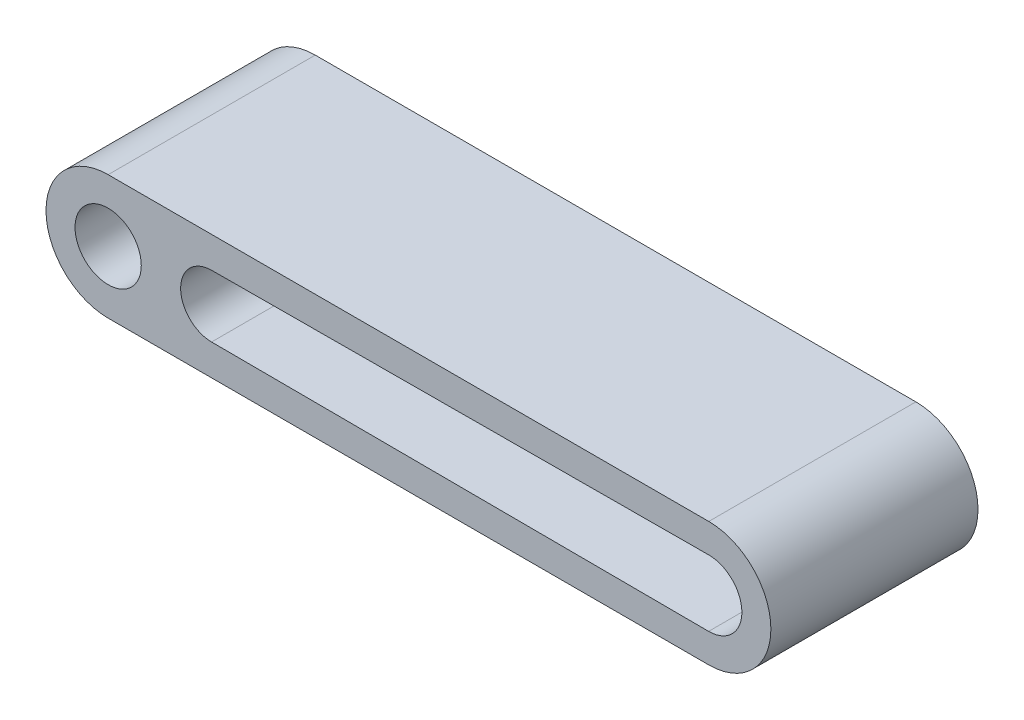
ISO-10303-21;
HEADER;
FILE_DESCRIPTION(('STEP AP214'),'2;1');
FILE_NAME('part.step','',(''),(''),'','','');
FILE_SCHEMA(('AUTOMOTIVE_DESIGN { 1 0 10303 214 1 1 1 1 }'));
ENDSEC;
DATA;
#1=APPLICATION_CONTEXT('core data for automotive mechanical design processes');
#2=APPLICATION_PROTOCOL_DEFINITION('international standard','automotive_design',2000,#1);
#3=PRODUCT_CONTEXT('',#1,'mechanical');
#4=PRODUCT('Part','Part','',(#3));
#5=PRODUCT_RELATED_PRODUCT_CATEGORY('part','',(#4));
#6=PRODUCT_DEFINITION_FORMATION('','',#4);
#7=PRODUCT_DEFINITION_CONTEXT('part definition',#1,'design');
#8=PRODUCT_DEFINITION('design','',#6,#7);
#9=PRODUCT_DEFINITION_SHAPE('','',#8);
#10=(LENGTH_UNIT() NAMED_UNIT(*) SI_UNIT(.MILLI.,.METRE.));
#11=(NAMED_UNIT(*) PLANE_ANGLE_UNIT() SI_UNIT($,.RADIAN.));
#12=(NAMED_UNIT(*) SI_UNIT($,.STERADIAN.) SOLID_ANGLE_UNIT());
#13=UNCERTAINTY_MEASURE_WITH_UNIT(LENGTH_MEASURE(1.E-05),#10,'distance_accuracy_value','');
#14=(GEOMETRIC_REPRESENTATION_CONTEXT(3) GLOBAL_UNCERTAINTY_ASSIGNED_CONTEXT((#13)) GLOBAL_UNIT_ASSIGNED_CONTEXT((#10,
#11,#12)) REPRESENTATION_CONTEXT('',''));
#15=CARTESIAN_POINT('',(0.,0.,0.));
#16=DIRECTION('',(0.,0.,1.));
#17=DIRECTION('',(1.,0.,0.));
#18=AXIS2_PLACEMENT_3D('',#15,#16,#17);
#19=CARTESIAN_POINT('',(0.,0.,10.));
#20=DIRECTION('',(0.,0.,1.));
#21=DIRECTION('',(1.,0.,0.));
#22=AXIS2_PLACEMENT_3D('',#19,#20,#21);
#23=PLANE('',#22);
#24=CARTESIAN_POINT('',(0.,0.,10.));
#25=DIRECTION('',(0.,0.,1.));
#26=DIRECTION('',(1.,0.,0.));
#27=AXIS2_PLACEMENT_3D('',#24,#25,#26);
#28=CIRCLE('',#27,3.);
#29=CARTESIAN_POINT('',(0.,3.,10.));
#30=VERTEX_POINT('',#29);
#31=CARTESIAN_POINT('',(0.,-3.,10.));
#32=VERTEX_POINT('',#31);
#33=EDGE_CURVE('E140',#30,#32,#28,.T.);
#34=ORIENTED_EDGE('',*,*,#33,.T.);
#35=DIRECTION('',(1.,0.,0.));
#36=VECTOR('',#35,1.);
#37=CARTESIAN_POINT('',(0.,-3.,10.));
#38=LINE('',#37,#36);
#39=CARTESIAN_POINT('',(29.0002083324291,-3.,10.));
#40=VERTEX_POINT('',#39);
#41=EDGE_CURVE('E143',#32,#40,#38,.T.);
#42=ORIENTED_EDGE('',*,*,#41,.T.);
#43=CARTESIAN_POINT('',(29.0002083324291,0.,10.));
#44=DIRECTION('',(0.,0.,1.));
#45=DIRECTION('',(1.,0.,0.));
#46=AXIS2_PLACEMENT_3D('',#43,#44,#45);
#47=CIRCLE('',#46,3.);
#48=CARTESIAN_POINT('',(29.0002083324291,3.,10.));
#49=VERTEX_POINT('',#48);
#50=EDGE_CURVE('E146',#40,#49,#47,.T.);
#51=ORIENTED_EDGE('',*,*,#50,.T.);
#52=DIRECTION('',(-1.,0.,0.));
#53=VECTOR('',#52,1.);
#54=CARTESIAN_POINT('',(0.,3.,10.));
#55=LINE('',#54,#53);
#56=EDGE_CURVE('E148',#49,#30,#55,.T.);
#57=ORIENTED_EDGE('',*,*,#56,.T.);
#58=EDGE_LOOP('',(#34,#42,#51,#57));
#59=FACE_BOUND('',#58,.T.);
#60=CARTESIAN_POINT('',(0.,0.,10.));
#61=DIRECTION('',(0.,0.,1.));
#62=DIRECTION('',(1.,0.,0.));
#63=AXIS2_PLACEMENT_3D('',#60,#61,#62);
#64=CIRCLE('',#63,1.6);
#65=CARTESIAN_POINT('',(1.6,0.,10.));
#66=VERTEX_POINT('',#65);
#67=EDGE_CURVE('E134',#66,#66,#64,.T.);
#68=ORIENTED_EDGE('',*,*,#67,.F.);
#69=EDGE_LOOP('',(#68));
#70=FACE_BOUND('',#69,.T.);
#71=DIRECTION('',(0.999991319557471,-0.00416663049815612,0.));
#72=VECTOR('',#71,1.);
#73=CARTESIAN_POINT('',(4.99375005425277,-1.49998697933621,10.));
#74=LINE('',#73,#72);
#75=CARTESIAN_POINT('',(4.99375005425277,-1.49998697933621,10.));
#76=VERTEX_POINT('',#75);
#77=CARTESIAN_POINT('',(28.9935417236321,-1.59998611129195,10.));
#78=VERTEX_POINT('',#77);
#79=EDGE_CURVE('E106',#76,#78,#74,.T.);
#80=ORIENTED_EDGE('',*,*,#79,.F.);
#81=CARTESIAN_POINT('',(5.,0.,10.));
#82=DIRECTION('',(0.,0.,1.));
#83=DIRECTION('',(1.,0.,0.));
#84=AXIS2_PLACEMENT_3D('',#81,#82,#83);
#85=CIRCLE('',#84,1.5);
#86=CARTESIAN_POINT('',(4.99375005425277,1.49998697933621,10.));
#87=VERTEX_POINT('',#86);
#88=EDGE_CURVE('E98',#87,#76,#85,.T.);
#89=ORIENTED_EDGE('',*,*,#88,.F.);
#90=DIRECTION('',(-0.999991319557471,-0.00416663049815614,0.));
#91=VECTOR('',#90,1.);
#92=CARTESIAN_POINT('',(4.99375005425277,1.49998697933621,10.));
#93=LINE('',#92,#91);
#94=CARTESIAN_POINT('',(28.9935417236321,1.59998611129195,10.));
#95=VERTEX_POINT('',#94);
#96=EDGE_CURVE('E120',#95,#87,#93,.T.);
#97=ORIENTED_EDGE('',*,*,#96,.F.);
#98=CARTESIAN_POINT('',(29.0002083324291,0.,10.));
#99=DIRECTION('',(0.,0.,1.));
#100=DIRECTION('',(1.,0.,0.));
#101=AXIS2_PLACEMENT_3D('',#98,#99,#100);
#102=CIRCLE('',#101,1.6);
#103=EDGE_CURVE('E118',#78,#95,#102,.T.);
#104=ORIENTED_EDGE('',*,*,#103,.F.);
#105=EDGE_LOOP('',(#80,#89,#97,#104));
#106=FACE_BOUND('',#105,.T.);
#107=ADVANCED_FACE('F33',(#59,#70,#106),#23,.T.);
#108=CARTESIAN_POINT('',(0.,0.,0.));
#109=DIRECTION('',(0.,0.,1.));
#110=DIRECTION('',(1.,0.,0.));
#111=AXIS2_PLACEMENT_3D('',#108,#109,#110);
#112=PLANE('',#111);
#113=CARTESIAN_POINT('',(0.,0.,0.));
#114=DIRECTION('',(0.,0.,1.));
#115=DIRECTION('',(1.,0.,0.));
#116=AXIS2_PLACEMENT_3D('',#113,#114,#115);
#117=CIRCLE('',#116,1.6);
#118=CARTESIAN_POINT('',(1.6,0.,0.));
#119=VERTEX_POINT('',#118);
#120=EDGE_CURVE('E114',#119,#119,#117,.T.);
#121=ORIENTED_EDGE('',*,*,#120,.T.);
#122=EDGE_LOOP('',(#121));
#123=FACE_BOUND('',#122,.T.);
#124=CARTESIAN_POINT('',(0.,0.,0.));
#125=DIRECTION('',(0.,0.,1.));
#126=DIRECTION('',(1.,0.,0.));
#127=AXIS2_PLACEMENT_3D('',#124,#125,#126);
#128=CIRCLE('',#127,3.);
#129=CARTESIAN_POINT('',(0.,3.,0.));
#130=VERTEX_POINT('',#129);
#131=CARTESIAN_POINT('',(0.,-3.,0.));
#132=VERTEX_POINT('',#131);
#133=EDGE_CURVE('E137',#130,#132,#128,.T.);
#134=ORIENTED_EDGE('',*,*,#133,.F.);
#135=DIRECTION('',(-1.,0.,0.));
#136=VECTOR('',#135,1.);
#137=CARTESIAN_POINT('',(0.,3.,0.));
#138=LINE('',#137,#136);
#139=CARTESIAN_POINT('',(29.0002083324291,3.,0.));
#140=VERTEX_POINT('',#139);
#141=EDGE_CURVE('E144',#140,#130,#138,.T.);
#142=ORIENTED_EDGE('',*,*,#141,.F.);
#143=CARTESIAN_POINT('',(29.0002083324291,0.,0.));
#144=DIRECTION('',(0.,0.,1.));
#145=DIRECTION('',(1.,0.,0.));
#146=AXIS2_PLACEMENT_3D('',#143,#144,#145);
#147=CIRCLE('',#146,3.);
#148=CARTESIAN_POINT('',(29.0002083324291,-3.,0.));
#149=VERTEX_POINT('',#148);
#150=EDGE_CURVE('E155',#149,#140,#147,.T.);
#151=ORIENTED_EDGE('',*,*,#150,.F.);
#152=DIRECTION('',(1.,0.,0.));
#153=VECTOR('',#152,1.);
#154=CARTESIAN_POINT('',(0.,-3.,0.));
#155=LINE('',#154,#153);
#156=EDGE_CURVE('E153',#132,#149,#155,.T.);
#157=ORIENTED_EDGE('',*,*,#156,.F.);
#158=EDGE_LOOP('',(#134,#142,#151,#157));
#159=FACE_BOUND('',#158,.T.);
#160=CARTESIAN_POINT('',(5.,0.,0.));
#161=DIRECTION('',(0.,0.,1.));
#162=DIRECTION('',(1.,0.,0.));
#163=AXIS2_PLACEMENT_3D('',#160,#161,#162);
#164=CIRCLE('',#163,1.5);
#165=CARTESIAN_POINT('',(4.99375005425277,1.49998697933621,0.));
#166=VERTEX_POINT('',#165);
#167=CARTESIAN_POINT('',(4.99375005425277,-1.49998697933621,0.));
#168=VERTEX_POINT('',#167);
#169=EDGE_CURVE('E56',#166,#168,#164,.T.);
#170=ORIENTED_EDGE('',*,*,#169,.T.);
#171=DIRECTION('',(0.999991319557471,-0.00416663049815612,0.));
#172=VECTOR('',#171,1.);
#173=CARTESIAN_POINT('',(4.99375005425277,-1.49998697933621,0.));
#174=LINE('',#173,#172);
#175=CARTESIAN_POINT('',(28.9935417236321,-1.59998611129195,0.));
#176=VERTEX_POINT('',#175);
#177=EDGE_CURVE('E113',#168,#176,#174,.T.);
#178=ORIENTED_EDGE('',*,*,#177,.T.);
#179=CARTESIAN_POINT('',(29.0002083324291,0.,0.));
#180=DIRECTION('',(0.,0.,1.));
#181=DIRECTION('',(1.,0.,0.));
#182=AXIS2_PLACEMENT_3D('',#179,#180,#181);
#183=CIRCLE('',#182,1.6);
#184=CARTESIAN_POINT('',(28.9935417236321,1.59998611129195,0.));
#185=VERTEX_POINT('',#184);
#186=EDGE_CURVE('E126',#176,#185,#183,.T.);
#187=ORIENTED_EDGE('',*,*,#186,.T.);
#188=DIRECTION('',(-0.999991319557471,-0.00416663049815614,0.));
#189=VECTOR('',#188,1.);
#190=CARTESIAN_POINT('',(4.99375005425277,1.49998697933621,0.));
#191=LINE('',#190,#189);
#192=EDGE_CURVE('E107',#185,#166,#191,.T.);
#193=ORIENTED_EDGE('',*,*,#192,.T.);
#194=EDGE_LOOP('',(#170,#178,#187,#193));
#195=FACE_BOUND('',#194,.T.);
#196=ADVANCED_FACE('F173',(#123,#159,#195),#112,.F.);
#197=CARTESIAN_POINT('',(0.,0.,10.));
#198=DIRECTION('',(0.,0.,-1.));
#199=DIRECTION('',(-1.,0.,0.));
#200=AXIS2_PLACEMENT_3D('',#197,#198,#199);
#201=CYLINDRICAL_SURFACE('',#200,3.);
#202=ORIENTED_EDGE('',*,*,#133,.T.);
#203=DIRECTION('',(0.,0.,-1.));
#204=VECTOR('',#203,1.);
#205=CARTESIAN_POINT('',(0.,-3.,10.));
#206=LINE('',#205,#204);
#207=EDGE_CURVE('E11',#32,#132,#206,.T.);
#208=ORIENTED_EDGE('',*,*,#207,.F.);
#209=ORIENTED_EDGE('',*,*,#33,.F.);
#210=DIRECTION('',(0.,0.,-1.));
#211=VECTOR('',#210,1.);
#212=CARTESIAN_POINT('',(0.,3.,10.));
#213=LINE('',#212,#211);
#214=EDGE_CURVE('E150',#30,#130,#213,.T.);
#215=ORIENTED_EDGE('',*,*,#214,.T.);
#216=EDGE_LOOP('',(#202,#208,#209,#215));
#217=FACE_BOUND('',#216,.T.);
#218=ADVANCED_FACE('F35',(#217),#201,.T.);
#219=CARTESIAN_POINT('',(0.,-3.,10.));
#220=DIRECTION('',(0.,1.,0.));
#221=DIRECTION('',(0.,0.,1.));
#222=AXIS2_PLACEMENT_3D('',#219,#220,#221);
#223=PLANE('',#222);
#224=ORIENTED_EDGE('',*,*,#156,.T.);
#225=DIRECTION('',(0.,0.,-1.));
#226=VECTOR('',#225,1.);
#227=CARTESIAN_POINT('',(29.0002083324291,-3.,10.));
#228=LINE('',#227,#226);
#229=EDGE_CURVE('E41',#40,#149,#228,.T.);
#230=ORIENTED_EDGE('',*,*,#229,.F.);
#231=ORIENTED_EDGE('',*,*,#41,.F.);
#232=ORIENTED_EDGE('',*,*,#207,.T.);
#233=EDGE_LOOP('',(#224,#230,#231,#232));
#234=FACE_BOUND('',#233,.T.);
#235=ADVANCED_FACE('F184',(#234),#223,.F.);
#236=CARTESIAN_POINT('',(29.0002083324291,0.,10.));
#237=DIRECTION('',(0.,0.,-1.));
#238=DIRECTION('',(-1.,0.,0.));
#239=AXIS2_PLACEMENT_3D('',#236,#237,#238);
#240=CYLINDRICAL_SURFACE('',#239,3.);
#241=ORIENTED_EDGE('',*,*,#150,.T.);
#242=DIRECTION('',(0.,0.,-1.));
#243=VECTOR('',#242,1.);
#244=CARTESIAN_POINT('',(29.0002083324291,3.,10.));
#245=LINE('',#244,#243);
#246=EDGE_CURVE('E160',#49,#140,#245,.T.);
#247=ORIENTED_EDGE('',*,*,#246,.F.);
#248=ORIENTED_EDGE('',*,*,#50,.F.);
#249=ORIENTED_EDGE('',*,*,#229,.T.);
#250=EDGE_LOOP('',(#241,#247,#248,#249));
#251=FACE_BOUND('',#250,.T.);
#252=ADVANCED_FACE('F167',(#251),#240,.T.);
#253=CARTESIAN_POINT('',(0.,3.,10.));
#254=DIRECTION('',(0.,-1.,0.));
#255=DIRECTION('',(0.,0.,-1.));
#256=AXIS2_PLACEMENT_3D('',#253,#254,#255);
#257=PLANE('',#256);
#258=ORIENTED_EDGE('',*,*,#141,.T.);
#259=ORIENTED_EDGE('',*,*,#214,.F.);
#260=ORIENTED_EDGE('',*,*,#56,.F.);
#261=ORIENTED_EDGE('',*,*,#246,.T.);
#262=EDGE_LOOP('',(#258,#259,#260,#261));
#263=FACE_BOUND('',#262,.T.);
#264=ADVANCED_FACE('F177',(#263),#257,.F.);
#265=CARTESIAN_POINT('',(0.,0.,10.));
#266=DIRECTION('',(0.,0.,-1.));
#267=DIRECTION('',(-1.,0.,0.));
#268=AXIS2_PLACEMENT_3D('',#265,#266,#267);
#269=CYLINDRICAL_SURFACE('',#268,1.6);
#270=ORIENTED_EDGE('',*,*,#67,.T.);
#271=EDGE_LOOP('',(#270));
#272=FACE_BOUND('',#271,.T.);
#273=ORIENTED_EDGE('',*,*,#120,.F.);
#274=EDGE_LOOP('',(#273));
#275=FACE_BOUND('',#274,.T.);
#276=ADVANCED_FACE('F199',(#272,#275),#269,.F.);
#277=CARTESIAN_POINT('',(5.,0.,10.));
#278=DIRECTION('',(0.,0.,-1.));
#279=DIRECTION('',(-1.,0.,0.));
#280=AXIS2_PLACEMENT_3D('',#277,#278,#279);
#281=CYLINDRICAL_SURFACE('',#280,1.5);
#282=ORIENTED_EDGE('',*,*,#169,.F.);
#283=DIRECTION('',(0.,0.,-1.));
#284=VECTOR('',#283,1.);
#285=CARTESIAN_POINT('',(4.99375005425277,1.49998697933621,10.));
#286=LINE('',#285,#284);
#287=EDGE_CURVE('E102',#87,#166,#286,.T.);
#288=ORIENTED_EDGE('',*,*,#287,.F.);
#289=ORIENTED_EDGE('',*,*,#88,.T.);
#290=DIRECTION('',(0.,0.,-1.));
#291=VECTOR('',#290,1.);
#292=CARTESIAN_POINT('',(4.99375005425277,-1.49998697933621,10.));
#293=LINE('',#292,#291);
#294=EDGE_CURVE('E101',#76,#168,#293,.T.);
#295=ORIENTED_EDGE('',*,*,#294,.T.);
#296=EDGE_LOOP('',(#282,#288,#289,#295));
#297=FACE_BOUND('',#296,.T.);
#298=ADVANCED_FACE('F100',(#297),#281,.F.);
#299=CARTESIAN_POINT('',(4.99375005425277,-1.49998697933621,10.));
#300=DIRECTION('',(0.00416663049815612,0.999991319557471,0.));
#301=DIRECTION('',(-0.999991319557471,0.00416663049815612,0.));
#302=AXIS2_PLACEMENT_3D('',#299,#300,#301);
#303=PLANE('',#302);
#304=ORIENTED_EDGE('',*,*,#177,.F.);
#305=ORIENTED_EDGE('',*,*,#294,.F.);
#306=ORIENTED_EDGE('',*,*,#79,.T.);
#307=DIRECTION('',(0.,0.,-1.));
#308=VECTOR('',#307,1.);
#309=CARTESIAN_POINT('',(28.9935417236321,-1.59998611129195,10.));
#310=LINE('',#309,#308);
#311=EDGE_CURVE('E115',#78,#176,#310,.T.);
#312=ORIENTED_EDGE('',*,*,#311,.T.);
#313=EDGE_LOOP('',(#304,#305,#306,#312));
#314=FACE_BOUND('',#313,.T.);
#315=ADVANCED_FACE('F110',(#314),#303,.T.);
#316=CARTESIAN_POINT('',(29.0002083324291,0.,10.));
#317=DIRECTION('',(0.,0.,-1.));
#318=DIRECTION('',(-1.,0.,0.));
#319=AXIS2_PLACEMENT_3D('',#316,#317,#318);
#320=CYLINDRICAL_SURFACE('',#319,1.6);
#321=ORIENTED_EDGE('',*,*,#186,.F.);
#322=ORIENTED_EDGE('',*,*,#311,.F.);
#323=ORIENTED_EDGE('',*,*,#103,.T.);
#324=DIRECTION('',(0.,0.,-1.));
#325=VECTOR('',#324,1.);
#326=CARTESIAN_POINT('',(28.9935417236321,1.59998611129195,10.));
#327=LINE('',#326,#325);
#328=EDGE_CURVE('E48',#95,#185,#327,.T.);
#329=ORIENTED_EDGE('',*,*,#328,.T.);
#330=EDGE_LOOP('',(#321,#322,#323,#329));
#331=FACE_BOUND('',#330,.T.);
#332=ADVANCED_FACE('F216',(#331),#320,.F.);
#333=CARTESIAN_POINT('',(4.99375005425277,1.49998697933621,10.));
#334=DIRECTION('',(0.00416663049815614,-0.999991319557471,0.));
#335=DIRECTION('',(0.999991319557471,0.00416663049815614,0.));
#336=AXIS2_PLACEMENT_3D('',#333,#334,#335);
#337=PLANE('',#336);
#338=ORIENTED_EDGE('',*,*,#192,.F.);
#339=ORIENTED_EDGE('',*,*,#328,.F.);
#340=ORIENTED_EDGE('',*,*,#96,.T.);
#341=ORIENTED_EDGE('',*,*,#287,.T.);
#342=EDGE_LOOP('',(#338,#339,#340,#341));
#343=FACE_BOUND('',#342,.T.);
#344=ADVANCED_FACE('F221',(#343),#337,.T.);
#345=CLOSED_SHELL('',(#107,#196,#218,#235,#252,#264,#276,#298,#315,#332,#344));
#346=MANIFOLD_SOLID_BREP('B2',#345);
#347=ADVANCED_BREP_SHAPE_REPRESENTATION('',(#18,#346),#14);
#348=SHAPE_DEFINITION_REPRESENTATION(#9,#347);
ENDSEC;
END-ISO-10303-21;
